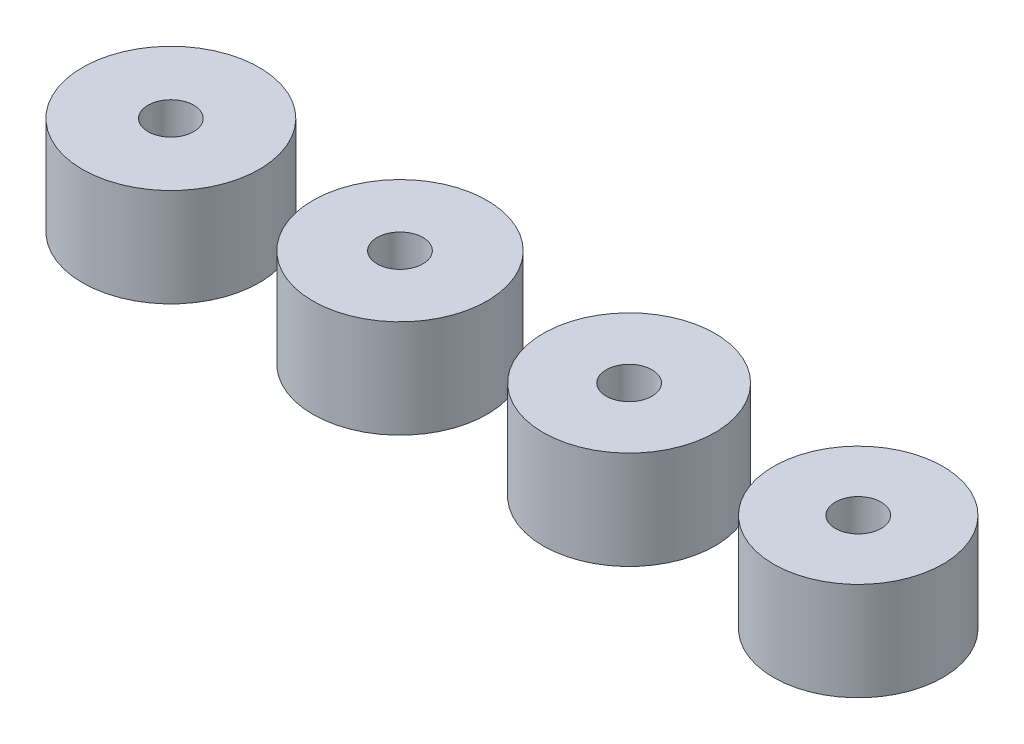
ISO-10303-21;
HEADER;
FILE_DESCRIPTION(('STEP AP214'),'2;1');
FILE_NAME('part.step','',(''),(''),'','','');
FILE_SCHEMA(('AUTOMOTIVE_DESIGN { 1 0 10303 214 1 1 1 1 }'));
ENDSEC;
DATA;
#1=APPLICATION_CONTEXT('core data for automotive mechanical design processes');
#2=APPLICATION_PROTOCOL_DEFINITION('international standard','automotive_design',2000,#1);
#3=PRODUCT_CONTEXT('',#1,'mechanical');
#4=PRODUCT('Part','Part','',(#3));
#5=PRODUCT_RELATED_PRODUCT_CATEGORY('part','',(#4));
#6=PRODUCT_DEFINITION_FORMATION('','',#4);
#7=PRODUCT_DEFINITION_CONTEXT('part definition',#1,'design');
#8=PRODUCT_DEFINITION('design','',#6,#7);
#9=PRODUCT_DEFINITION_SHAPE('','',#8);
#10=(LENGTH_UNIT() NAMED_UNIT(*) SI_UNIT(.MILLI.,.METRE.));
#11=(NAMED_UNIT(*) PLANE_ANGLE_UNIT() SI_UNIT($,.RADIAN.));
#12=(NAMED_UNIT(*) SI_UNIT($,.STERADIAN.) SOLID_ANGLE_UNIT());
#13=UNCERTAINTY_MEASURE_WITH_UNIT(LENGTH_MEASURE(1.E-05),#10,'distance_accuracy_value','');
#14=(GEOMETRIC_REPRESENTATION_CONTEXT(3) GLOBAL_UNCERTAINTY_ASSIGNED_CONTEXT((#13)) GLOBAL_UNIT_ASSIGNED_CONTEXT((#10,
#11,#12)) REPRESENTATION_CONTEXT('',''));
#15=CARTESIAN_POINT('',(0.,0.,0.));
#16=DIRECTION('',(0.,0.,1.));
#17=DIRECTION('',(1.,0.,0.));
#18=AXIS2_PLACEMENT_3D('',#15,#16,#17);
#19=CARTESIAN_POINT('',(42.,12.,302.800228055546));
#20=DIRECTION('',(0.,1.,0.));
#21=DIRECTION('',(0.,0.,1.));
#22=AXIS2_PLACEMENT_3D('',#19,#20,#21);
#23=PLANE('',#22);
#24=CARTESIAN_POINT('',(42.,12.,302.800228055546));
#25=DIRECTION('',(0.,1.,0.));
#26=DIRECTION('',(0.,0.,1.));
#27=AXIS2_PLACEMENT_3D('',#24,#25,#26);
#28=CIRCLE('',#27,5.17499999999999);
#29=CARTESIAN_POINT('',(42.,12.,307.975228055546));
#30=VERTEX_POINT('',#29);
#31=EDGE_CURVE('E11',#30,#30,#28,.T.);
#32=ORIENTED_EDGE('',*,*,#31,.T.);
#33=EDGE_LOOP('',(#32));
#34=FACE_BOUND('',#33,.T.);
#35=CARTESIAN_POINT('',(42.,12.,302.800228055546));
#36=DIRECTION('',(0.,1.,0.));
#37=DIRECTION('',(0.,0.,1.));
#38=AXIS2_PLACEMENT_3D('',#35,#36,#37);
#39=CIRCLE('',#38,1.40000000000002);
#40=CARTESIAN_POINT('',(42.,12.,304.200228055546));
#41=VERTEX_POINT('',#40);
#42=EDGE_CURVE('E53',#41,#41,#39,.T.);
#43=ORIENTED_EDGE('',*,*,#42,.F.);
#44=EDGE_LOOP('',(#43));
#45=FACE_BOUND('',#44,.T.);
#46=ADVANCED_FACE('F42',(#34,#45),#23,.T.);
#47=CARTESIAN_POINT('',(42.,6.,302.800228055546));
#48=DIRECTION('',(0.,1.,0.));
#49=DIRECTION('',(0.,0.,1.));
#50=AXIS2_PLACEMENT_3D('',#47,#48,#49);
#51=PLANE('',#50);
#52=CARTESIAN_POINT('',(42.,6.,302.800228055546));
#53=DIRECTION('',(0.,1.,0.));
#54=DIRECTION('',(0.,0.,1.));
#55=AXIS2_PLACEMENT_3D('',#52,#53,#54);
#56=CIRCLE('',#55,5.17499999999999);
#57=CARTESIAN_POINT('',(42.,6.,307.975228055546));
#58=VERTEX_POINT('',#57);
#59=EDGE_CURVE('E46',#58,#58,#56,.T.);
#60=ORIENTED_EDGE('',*,*,#59,.F.);
#61=EDGE_LOOP('',(#60));
#62=FACE_BOUND('',#61,.T.);
#63=CARTESIAN_POINT('',(42.,6.,302.800228055546));
#64=DIRECTION('',(0.,1.,0.));
#65=DIRECTION('',(0.,0.,1.));
#66=AXIS2_PLACEMENT_3D('',#63,#64,#65);
#67=CIRCLE('',#66,1.40000000000002);
#68=CARTESIAN_POINT('',(42.,6.,304.200228055546));
#69=VERTEX_POINT('',#68);
#70=EDGE_CURVE('E55',#69,#69,#67,.T.);
#71=ORIENTED_EDGE('',*,*,#70,.T.);
#72=EDGE_LOOP('',(#71));
#73=FACE_BOUND('',#72,.T.);
#74=ADVANCED_FACE('F65',(#62,#73),#51,.F.);
#75=CARTESIAN_POINT('',(42.,12.,302.800228055546));
#76=DIRECTION('',(0.,-1.,0.));
#77=DIRECTION('',(0.,0.,-1.));
#78=AXIS2_PLACEMENT_3D('',#75,#76,#77);
#79=CYLINDRICAL_SURFACE('',#78,5.17499999999999);
#80=ORIENTED_EDGE('',*,*,#31,.F.);
#81=EDGE_LOOP('',(#80));
#82=FACE_BOUND('',#81,.T.);
#83=ORIENTED_EDGE('',*,*,#59,.T.);
#84=EDGE_LOOP('',(#83));
#85=FACE_BOUND('',#84,.T.);
#86=ADVANCED_FACE('F44',(#82,#85),#79,.T.);
#87=CARTESIAN_POINT('',(42.,12.,302.800228055546));
#88=DIRECTION('',(0.,-1.,0.));
#89=DIRECTION('',(0.,0.,-1.));
#90=AXIS2_PLACEMENT_3D('',#87,#88,#89);
#91=CYLINDRICAL_SURFACE('',#90,1.40000000000002);
#92=ORIENTED_EDGE('',*,*,#42,.T.);
#93=EDGE_LOOP('',(#92));
#94=FACE_BOUND('',#93,.T.);
#95=ORIENTED_EDGE('',*,*,#70,.F.);
#96=EDGE_LOOP('',(#95));
#97=FACE_BOUND('',#96,.T.);
#98=ADVANCED_FACE('F61',(#94,#97),#91,.F.);
#99=CLOSED_SHELL('',(#46,#74,#86,#98));
#100=MANIFOLD_SOLID_BREP('B2',#99);
#101=CARTESIAN_POINT('',(28.,12.,302.800228055546));
#102=DIRECTION('',(0.,1.,0.));
#103=DIRECTION('',(0.,0.,1.));
#104=AXIS2_PLACEMENT_3D('',#101,#102,#103);
#105=PLANE('',#104);
#106=CARTESIAN_POINT('',(28.,12.,302.800228055546));
#107=DIRECTION('',(0.,1.,0.));
#108=DIRECTION('',(0.,0.,1.));
#109=AXIS2_PLACEMENT_3D('',#106,#107,#108);
#110=CIRCLE('',#109,5.25);
#111=CARTESIAN_POINT('',(28.,12.,308.050228055546));
#112=VERTEX_POINT('',#111);
#113=EDGE_CURVE('E41',#112,#112,#110,.T.);
#114=ORIENTED_EDGE('',*,*,#113,.T.);
#115=EDGE_LOOP('',(#114));
#116=FACE_BOUND('',#115,.T.);
#117=CARTESIAN_POINT('',(28.,12.,302.800228055546));
#118=DIRECTION('',(0.,1.,0.));
#119=DIRECTION('',(0.,0.,1.));
#120=AXIS2_PLACEMENT_3D('',#117,#118,#119);
#121=CIRCLE('',#120,1.4);
#122=CARTESIAN_POINT('',(28.,12.,304.200228055546));
#123=VERTEX_POINT('',#122);
#124=EDGE_CURVE('E123',#123,#123,#121,.T.);
#125=ORIENTED_EDGE('',*,*,#124,.F.);
#126=EDGE_LOOP('',(#125));
#127=FACE_BOUND('',#126,.T.);
#128=ADVANCED_FACE('F112',(#116,#127),#105,.T.);
#129=CARTESIAN_POINT('',(28.,6.,302.800228055546));
#130=DIRECTION('',(0.,1.,0.));
#131=DIRECTION('',(0.,0.,1.));
#132=AXIS2_PLACEMENT_3D('',#129,#130,#131);
#133=PLANE('',#132);
#134=CARTESIAN_POINT('',(28.,6.,302.800228055546));
#135=DIRECTION('',(0.,1.,0.));
#136=DIRECTION('',(0.,0.,1.));
#137=AXIS2_PLACEMENT_3D('',#134,#135,#136);
#138=CIRCLE('',#137,5.25);
#139=CARTESIAN_POINT('',(28.,6.,308.050228055546));
#140=VERTEX_POINT('',#139);
#141=EDGE_CURVE('E116',#140,#140,#138,.T.);
#142=ORIENTED_EDGE('',*,*,#141,.F.);
#143=EDGE_LOOP('',(#142));
#144=FACE_BOUND('',#143,.T.);
#145=CARTESIAN_POINT('',(28.,6.,302.800228055546));
#146=DIRECTION('',(0.,1.,0.));
#147=DIRECTION('',(0.,0.,1.));
#148=AXIS2_PLACEMENT_3D('',#145,#146,#147);
#149=CIRCLE('',#148,1.4);
#150=CARTESIAN_POINT('',(28.,6.,304.200228055546));
#151=VERTEX_POINT('',#150);
#152=EDGE_CURVE('E125',#151,#151,#149,.T.);
#153=ORIENTED_EDGE('',*,*,#152,.T.);
#154=EDGE_LOOP('',(#153));
#155=FACE_BOUND('',#154,.T.);
#156=ADVANCED_FACE('F135',(#144,#155),#133,.F.);
#157=CARTESIAN_POINT('',(28.,12.,302.800228055546));
#158=DIRECTION('',(0.,-1.,0.));
#159=DIRECTION('',(0.,0.,-1.));
#160=AXIS2_PLACEMENT_3D('',#157,#158,#159);
#161=CYLINDRICAL_SURFACE('',#160,5.25);
#162=ORIENTED_EDGE('',*,*,#113,.F.);
#163=EDGE_LOOP('',(#162));
#164=FACE_BOUND('',#163,.T.);
#165=ORIENTED_EDGE('',*,*,#141,.T.);
#166=EDGE_LOOP('',(#165));
#167=FACE_BOUND('',#166,.T.);
#168=ADVANCED_FACE('F114',(#164,#167),#161,.T.);
#169=CARTESIAN_POINT('',(28.,12.,302.800228055546));
#170=DIRECTION('',(0.,-1.,0.));
#171=DIRECTION('',(0.,0.,-1.));
#172=AXIS2_PLACEMENT_3D('',#169,#170,#171);
#173=CYLINDRICAL_SURFACE('',#172,1.4);
#174=ORIENTED_EDGE('',*,*,#124,.T.);
#175=EDGE_LOOP('',(#174));
#176=FACE_BOUND('',#175,.T.);
#177=ORIENTED_EDGE('',*,*,#152,.F.);
#178=EDGE_LOOP('',(#177));
#179=FACE_BOUND('',#178,.T.);
#180=ADVANCED_FACE('F131',(#176,#179),#173,.F.);
#181=CLOSED_SHELL('',(#128,#156,#168,#180));
#182=MANIFOLD_SOLID_BREP('B6',#181);
#183=CARTESIAN_POINT('',(14.,12.,302.800228055546));
#184=DIRECTION('',(0.,1.,0.));
#185=DIRECTION('',(0.,0.,1.));
#186=AXIS2_PLACEMENT_3D('',#183,#184,#185);
#187=PLANE('',#186);
#188=CARTESIAN_POINT('',(14.,12.,302.800228055546));
#189=DIRECTION('',(0.,1.,0.));
#190=DIRECTION('',(0.,0.,1.));
#191=AXIS2_PLACEMENT_3D('',#188,#189,#190);
#192=CIRCLE('',#191,5.32500000000001);
#193=CARTESIAN_POINT('',(14.,12.,308.125228055546));
#194=VERTEX_POINT('',#193);
#195=EDGE_CURVE('E111',#194,#194,#192,.T.);
#196=ORIENTED_EDGE('',*,*,#195,.T.);
#197=EDGE_LOOP('',(#196));
#198=FACE_BOUND('',#197,.T.);
#199=CARTESIAN_POINT('',(14.,12.,302.800228055546));
#200=DIRECTION('',(0.,1.,0.));
#201=DIRECTION('',(0.,0.,1.));
#202=AXIS2_PLACEMENT_3D('',#199,#200,#201);
#203=CIRCLE('',#202,1.40000000000001);
#204=CARTESIAN_POINT('',(14.,12.,304.200228055546));
#205=VERTEX_POINT('',#204);
#206=EDGE_CURVE('E192',#205,#205,#203,.T.);
#207=ORIENTED_EDGE('',*,*,#206,.F.);
#208=EDGE_LOOP('',(#207));
#209=FACE_BOUND('',#208,.T.);
#210=ADVANCED_FACE('F181',(#198,#209),#187,.T.);
#211=CARTESIAN_POINT('',(14.,6.,302.800228055546));
#212=DIRECTION('',(0.,1.,0.));
#213=DIRECTION('',(0.,0.,1.));
#214=AXIS2_PLACEMENT_3D('',#211,#212,#213);
#215=PLANE('',#214);
#216=CARTESIAN_POINT('',(14.,6.,302.800228055546));
#217=DIRECTION('',(0.,1.,0.));
#218=DIRECTION('',(0.,0.,1.));
#219=AXIS2_PLACEMENT_3D('',#216,#217,#218);
#220=CIRCLE('',#219,5.32500000000001);
#221=CARTESIAN_POINT('',(14.,6.,308.125228055546));
#222=VERTEX_POINT('',#221);
#223=EDGE_CURVE('E185',#222,#222,#220,.T.);
#224=ORIENTED_EDGE('',*,*,#223,.F.);
#225=EDGE_LOOP('',(#224));
#226=FACE_BOUND('',#225,.T.);
#227=CARTESIAN_POINT('',(14.,6.,302.800228055546));
#228=DIRECTION('',(0.,1.,0.));
#229=DIRECTION('',(0.,0.,1.));
#230=AXIS2_PLACEMENT_3D('',#227,#228,#229);
#231=CIRCLE('',#230,1.40000000000001);
#232=CARTESIAN_POINT('',(14.,6.,304.200228055546));
#233=VERTEX_POINT('',#232);
#234=EDGE_CURVE('E194',#233,#233,#231,.T.);
#235=ORIENTED_EDGE('',*,*,#234,.T.);
#236=EDGE_LOOP('',(#235));
#237=FACE_BOUND('',#236,.T.);
#238=ADVANCED_FACE('F204',(#226,#237),#215,.F.);
#239=CARTESIAN_POINT('',(14.,12.,302.800228055546));
#240=DIRECTION('',(0.,-1.,0.));
#241=DIRECTION('',(0.,0.,-1.));
#242=AXIS2_PLACEMENT_3D('',#239,#240,#241);
#243=CYLINDRICAL_SURFACE('',#242,5.32500000000001);
#244=ORIENTED_EDGE('',*,*,#195,.F.);
#245=EDGE_LOOP('',(#244));
#246=FACE_BOUND('',#245,.T.);
#247=ORIENTED_EDGE('',*,*,#223,.T.);
#248=EDGE_LOOP('',(#247));
#249=FACE_BOUND('',#248,.T.);
#250=ADVANCED_FACE('F183',(#246,#249),#243,.T.);
#251=CARTESIAN_POINT('',(14.,12.,302.800228055546));
#252=DIRECTION('',(0.,-1.,0.));
#253=DIRECTION('',(0.,0.,-1.));
#254=AXIS2_PLACEMENT_3D('',#251,#252,#253);
#255=CYLINDRICAL_SURFACE('',#254,1.40000000000001);
#256=ORIENTED_EDGE('',*,*,#206,.T.);
#257=EDGE_LOOP('',(#256));
#258=FACE_BOUND('',#257,.T.);
#259=ORIENTED_EDGE('',*,*,#234,.F.);
#260=EDGE_LOOP('',(#259));
#261=FACE_BOUND('',#260,.T.);
#262=ADVANCED_FACE('F200',(#258,#261),#255,.F.);
#263=CLOSED_SHELL('',(#210,#238,#250,#262));
#264=MANIFOLD_SOLID_BREP('B36',#263);
#265=CARTESIAN_POINT('',(0.,12.,302.800228055546));
#266=DIRECTION('',(0.,1.,0.));
#267=DIRECTION('',(0.,0.,1.));
#268=AXIS2_PLACEMENT_3D('',#265,#266,#267);
#269=PLANE('',#268);
#270=CARTESIAN_POINT('',(0.,12.,302.800228055546));
#271=DIRECTION('',(0.,1.,0.));
#272=DIRECTION('',(0.,0.,1.));
#273=AXIS2_PLACEMENT_3D('',#270,#271,#272);
#274=CIRCLE('',#273,5.4);
#275=CARTESIAN_POINT('',(0.,12.,308.200228055546));
#276=VERTEX_POINT('',#275);
#277=EDGE_CURVE('E180',#276,#276,#274,.T.);
#278=ORIENTED_EDGE('',*,*,#277,.T.);
#279=EDGE_LOOP('',(#278));
#280=FACE_BOUND('',#279,.T.);
#281=CARTESIAN_POINT('',(0.,12.,302.800228055546));
#282=DIRECTION('',(0.,1.,0.));
#283=DIRECTION('',(0.,0.,1.));
#284=AXIS2_PLACEMENT_3D('',#281,#282,#283);
#285=CIRCLE('',#284,1.4);
#286=CARTESIAN_POINT('',(0.,12.,304.200228055546));
#287=VERTEX_POINT('',#286);
#288=EDGE_CURVE('E254',#287,#287,#285,.T.);
#289=ORIENTED_EDGE('',*,*,#288,.F.);
#290=EDGE_LOOP('',(#289));
#291=FACE_BOUND('',#290,.T.);
#292=ADVANCED_FACE('F243',(#280,#291),#269,.T.);
#293=CARTESIAN_POINT('',(0.,6.,302.800228055546));
#294=DIRECTION('',(0.,1.,0.));
#295=DIRECTION('',(0.,0.,1.));
#296=AXIS2_PLACEMENT_3D('',#293,#294,#295);
#297=PLANE('',#296);
#298=CARTESIAN_POINT('',(0.,6.,302.800228055546));
#299=DIRECTION('',(0.,1.,0.));
#300=DIRECTION('',(0.,0.,1.));
#301=AXIS2_PLACEMENT_3D('',#298,#299,#300);
#302=CIRCLE('',#301,5.4);
#303=CARTESIAN_POINT('',(0.,6.,308.200228055546));
#304=VERTEX_POINT('',#303);
#305=EDGE_CURVE('E247',#304,#304,#302,.T.);
#306=ORIENTED_EDGE('',*,*,#305,.F.);
#307=EDGE_LOOP('',(#306));
#308=FACE_BOUND('',#307,.T.);
#309=CARTESIAN_POINT('',(0.,6.,302.800228055546));
#310=DIRECTION('',(0.,1.,0.));
#311=DIRECTION('',(0.,0.,1.));
#312=AXIS2_PLACEMENT_3D('',#309,#310,#311);
#313=CIRCLE('',#312,1.4);
#314=CARTESIAN_POINT('',(0.,6.,304.200228055546));
#315=VERTEX_POINT('',#314);
#316=EDGE_CURVE('E256',#315,#315,#313,.T.);
#317=ORIENTED_EDGE('',*,*,#316,.T.);
#318=EDGE_LOOP('',(#317));
#319=FACE_BOUND('',#318,.T.);
#320=ADVANCED_FACE('F266',(#308,#319),#297,.F.);
#321=CARTESIAN_POINT('',(0.,12.,302.800228055546));
#322=DIRECTION('',(0.,-1.,0.));
#323=DIRECTION('',(0.,0.,-1.));
#324=AXIS2_PLACEMENT_3D('',#321,#322,#323);
#325=CYLINDRICAL_SURFACE('',#324,5.4);
#326=ORIENTED_EDGE('',*,*,#277,.F.);
#327=EDGE_LOOP('',(#326));
#328=FACE_BOUND('',#327,.T.);
#329=ORIENTED_EDGE('',*,*,#305,.T.);
#330=EDGE_LOOP('',(#329));
#331=FACE_BOUND('',#330,.T.);
#332=ADVANCED_FACE('F245',(#328,#331),#325,.T.);
#333=CARTESIAN_POINT('',(0.,12.,302.800228055546));
#334=DIRECTION('',(0.,-1.,0.));
#335=DIRECTION('',(0.,0.,-1.));
#336=AXIS2_PLACEMENT_3D('',#333,#334,#335);
#337=CYLINDRICAL_SURFACE('',#336,1.4);
#338=ORIENTED_EDGE('',*,*,#288,.T.);
#339=EDGE_LOOP('',(#338));
#340=FACE_BOUND('',#339,.T.);
#341=ORIENTED_EDGE('',*,*,#316,.F.);
#342=EDGE_LOOP('',(#341));
#343=FACE_BOUND('',#342,.T.);
#344=ADVANCED_FACE('F262',(#340,#343),#337,.F.);
#345=CLOSED_SHELL('',(#292,#320,#332,#344));
#346=MANIFOLD_SOLID_BREP('B106',#345);
#347=ADVANCED_BREP_SHAPE_REPRESENTATION('',(#18,#100,#182,#264,#346),#14);
#348=SHAPE_DEFINITION_REPRESENTATION(#9,#347);
ENDSEC;
END-ISO-10303-21;
